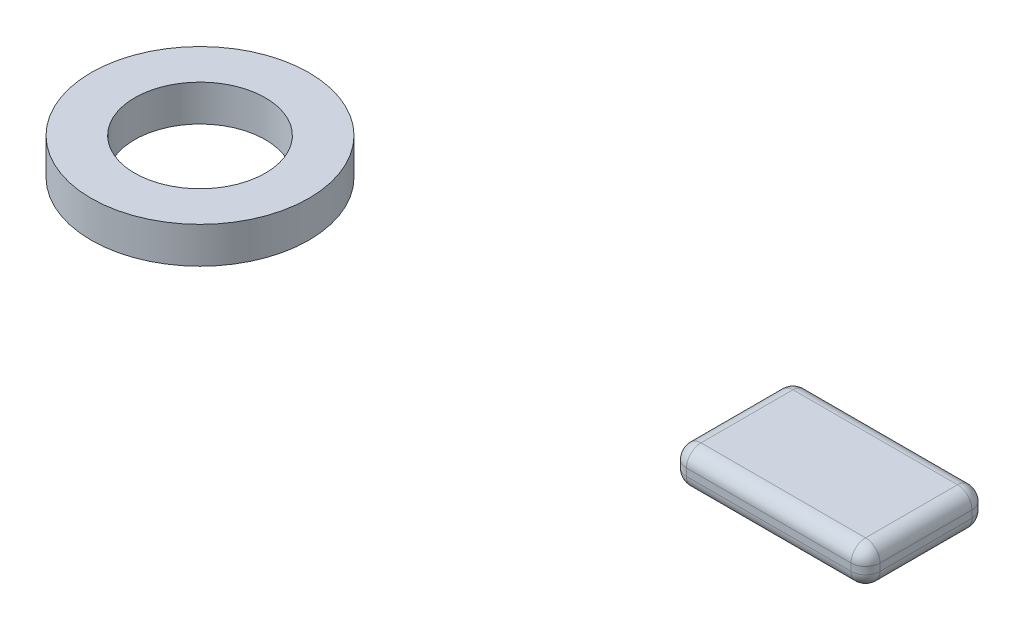
ISO-10303-21;
HEADER;
FILE_DESCRIPTION(('STEP AP214'),'2;1');
FILE_NAME('part.step','',(''),(''),'','','');
FILE_SCHEMA(('AUTOMOTIVE_DESIGN { 1 0 10303 214 1 1 1 1 }'));
ENDSEC;
DATA;
#1=APPLICATION_CONTEXT('core data for automotive mechanical design processes');
#2=APPLICATION_PROTOCOL_DEFINITION('international standard','automotive_design',2000,#1);
#3=PRODUCT_CONTEXT('',#1,'mechanical');
#4=PRODUCT('Part','Part','',(#3));
#5=PRODUCT_RELATED_PRODUCT_CATEGORY('part','',(#4));
#6=PRODUCT_DEFINITION_FORMATION('','',#4);
#7=PRODUCT_DEFINITION_CONTEXT('part definition',#1,'design');
#8=PRODUCT_DEFINITION('design','',#6,#7);
#9=PRODUCT_DEFINITION_SHAPE('','',#8);
#10=(LENGTH_UNIT() NAMED_UNIT(*) SI_UNIT(.MILLI.,.METRE.));
#11=(NAMED_UNIT(*) PLANE_ANGLE_UNIT() SI_UNIT($,.RADIAN.));
#12=(NAMED_UNIT(*) SI_UNIT($,.STERADIAN.) SOLID_ANGLE_UNIT());
#13=UNCERTAINTY_MEASURE_WITH_UNIT(LENGTH_MEASURE(1.E-05),#10,'distance_accuracy_value','');
#14=(GEOMETRIC_REPRESENTATION_CONTEXT(3) GLOBAL_UNCERTAINTY_ASSIGNED_CONTEXT((#13)) GLOBAL_UNIT_ASSIGNED_CONTEXT((#10,
#11,#12)) REPRESENTATION_CONTEXT('',''));
#15=CARTESIAN_POINT('',(0.,0.,0.));
#16=DIRECTION('',(0.,0.,1.));
#17=DIRECTION('',(1.,0.,0.));
#18=AXIS2_PLACEMENT_3D('',#15,#16,#17);
#19=CARTESIAN_POINT('',(0.,-39.5,151.));
#20=DIRECTION('',(0.,-1.,0.));
#21=DIRECTION('',(1.,0.,0.));
#22=AXIS2_PLACEMENT_3D('',#19,#20,#21);
#23=CYLINDRICAL_SURFACE('',#22,2.7);
#24=CARTESIAN_POINT('',(0.,-41.,151.));
#25=DIRECTION('',(0.,-1.,0.));
#26=DIRECTION('',(1.,0.,0.));
#27=AXIS2_PLACEMENT_3D('',#24,#25,#26);
#28=CIRCLE('',#27,2.7);
#29=CARTESIAN_POINT('',(2.7,-41.,151.));
#30=VERTEX_POINT('',#29);
#31=EDGE_CURVE('P0_E22',#30,#30,#28,.T.);
#32=ORIENTED_EDGE('',*,*,#31,.T.);
#33=EDGE_LOOP('',(#32));
#34=FACE_BOUND('',#33,.T.);
#35=CARTESIAN_POINT('',(0.,-39.5,151.));
#36=DIRECTION('',(0.,-1.,0.));
#37=DIRECTION('',(1.,0.,0.));
#38=AXIS2_PLACEMENT_3D('',#35,#36,#37);
#39=CIRCLE('',#38,2.7);
#40=CARTESIAN_POINT('',(2.7,-39.5,151.));
#41=VERTEX_POINT('',#40);
#42=EDGE_CURVE('P0_E10',#41,#41,#39,.T.);
#43=ORIENTED_EDGE('',*,*,#42,.F.);
#44=EDGE_LOOP('',(#43));
#45=FACE_BOUND('',#44,.T.);
#46=ADVANCED_FACE('P0_F15',(#34,#45),#23,.F.);
#47=CARTESIAN_POINT('',(0.,-39.5,151.));
#48=DIRECTION('',(0.,-1.,0.));
#49=DIRECTION('',(0.,0.,-1.));
#50=AXIS2_PLACEMENT_3D('',#47,#48,#49);
#51=PLANE('',#50);
#52=ORIENTED_EDGE('',*,*,#42,.T.);
#53=EDGE_LOOP('',(#52));
#54=FACE_BOUND('',#53,.T.);
#55=CARTESIAN_POINT('',(0.,-39.5,151.));
#56=DIRECTION('',(0.,-1.,0.));
#57=DIRECTION('',(1.,0.,0.));
#58=AXIS2_PLACEMENT_3D('',#55,#56,#57);
#59=CIRCLE('',#58,4.5);
#60=CARTESIAN_POINT('',(4.5,-39.5,151.));
#61=VERTEX_POINT('',#60);
#62=EDGE_CURVE('P0_E30',#61,#61,#59,.T.);
#63=ORIENTED_EDGE('',*,*,#62,.F.);
#64=EDGE_LOOP('',(#63));
#65=FACE_BOUND('',#64,.T.);
#66=ADVANCED_FACE('P0_F52',(#54,#65),#51,.F.);
#67=CARTESIAN_POINT('',(0.,-41.,151.));
#68=DIRECTION('',(0.,-1.,0.));
#69=DIRECTION('',(0.,0.,-1.));
#70=AXIS2_PLACEMENT_3D('',#67,#68,#69);
#71=PLANE('',#70);
#72=ORIENTED_EDGE('',*,*,#31,.F.);
#73=EDGE_LOOP('',(#72));
#74=FACE_BOUND('',#73,.T.);
#75=CARTESIAN_POINT('',(0.,-41.,151.));
#76=DIRECTION('',(0.,-1.,0.));
#77=DIRECTION('',(1.,0.,0.));
#78=AXIS2_PLACEMENT_3D('',#75,#76,#77);
#79=CIRCLE('',#78,4.5);
#80=CARTESIAN_POINT('',(4.5,-41.,151.));
#81=VERTEX_POINT('',#80);
#82=EDGE_CURVE('P0_E36',#81,#81,#79,.T.);
#83=ORIENTED_EDGE('',*,*,#82,.T.);
#84=EDGE_LOOP('',(#83));
#85=FACE_BOUND('',#84,.T.);
#86=ADVANCED_FACE('P0_F44',(#74,#85),#71,.T.);
#87=CARTESIAN_POINT('',(0.,-39.5,151.));
#88=DIRECTION('',(0.,-1.,0.));
#89=DIRECTION('',(1.,0.,0.));
#90=AXIS2_PLACEMENT_3D('',#87,#88,#89);
#91=CYLINDRICAL_SURFACE('',#90,4.5);
#92=ORIENTED_EDGE('',*,*,#82,.F.);
#93=EDGE_LOOP('',(#92));
#94=FACE_BOUND('',#93,.T.);
#95=ORIENTED_EDGE('',*,*,#62,.T.);
#96=EDGE_LOOP('',(#95));
#97=FACE_BOUND('',#96,.T.);
#98=ADVANCED_FACE('P0_F46',(#94,#97),#91,.T.);
#99=CLOSED_SHELL('',(#46,#66,#86,#98));
#100=MANIFOLD_SOLID_BREP('P0_B1',#99);
#101=CARTESIAN_POINT('',(29.4,-38.85,152.9));
#102=DIRECTION('',(0.,-1.,0.));
#103=DIRECTION('',(1.,0.,0.));
#104=AXIS2_PLACEMENT_3D('',#101,#102,#103);
#105=SPHERICAL_SURFACE('',#104,0.6);
#106=CARTESIAN_POINT('',(29.4,-38.85,152.9));
#107=DIRECTION('',(0.,0.,-1.));
#108=DIRECTION('',(1.,0.,0.));
#109=AXIS2_PLACEMENT_3D('',#106,#107,#108);
#110=CIRCLE('',#109,0.6);
#111=CARTESIAN_POINT('',(29.4,-38.25,152.9));
#112=VERTEX_POINT('',#111);
#113=CARTESIAN_POINT('',(30.,-38.85,152.9));
#114=VERTEX_POINT('',#113);
#115=EDGE_CURVE('P1_E10',#112,#114,#110,.T.);
#116=ORIENTED_EDGE('',*,*,#115,.F.);
#117=CARTESIAN_POINT('',(29.4,-38.85,152.9));
#118=DIRECTION('',(1.,0.,0.));
#119=DIRECTION('',(0.,0.,1.));
#120=AXIS2_PLACEMENT_3D('',#117,#118,#119);
#121=CIRCLE('',#120,0.6);
#122=CARTESIAN_POINT('',(29.4,-38.85,153.5));
#123=VERTEX_POINT('',#122);
#124=EDGE_CURVE('P1_E129',#112,#123,#121,.T.);
#125=ORIENTED_EDGE('',*,*,#124,.T.);
#126=CARTESIAN_POINT('',(29.4,-38.85,152.9));
#127=DIRECTION('',(0.,-1.,0.));
#128=DIRECTION('',(1.,0.,0.));
#129=AXIS2_PLACEMENT_3D('',#126,#127,#128);
#130=CIRCLE('',#129,0.6);
#131=EDGE_CURVE('P1_E118',#114,#123,#130,.T.);
#132=ORIENTED_EDGE('',*,*,#131,.F.);
#133=EDGE_LOOP('',(#116,#125,#132));
#134=FACE_BOUND('',#133,.T.);
#135=ADVANCED_FACE('P1_F16',(#134),#105,.T.);
#136=CARTESIAN_POINT('',(29.4,-38.85,149.1));
#137=DIRECTION('',(0.,0.,1.));
#138=DIRECTION('',(1.,0.,0.));
#139=AXIS2_PLACEMENT_3D('',#136,#137,#138);
#140=SPHERICAL_SURFACE('',#139,0.6);
#141=CARTESIAN_POINT('',(29.4,-38.85,149.1));
#142=DIRECTION('',(0.,-1.,0.));
#143=DIRECTION('',(1.,0.,0.));
#144=AXIS2_PLACEMENT_3D('',#141,#142,#143);
#145=CIRCLE('',#144,0.6);
#146=CARTESIAN_POINT('',(29.4,-38.85,148.5));
#147=VERTEX_POINT('',#146);
#148=CARTESIAN_POINT('',(30.,-38.85,149.1));
#149=VERTEX_POINT('',#148);
#150=EDGE_CURVE('P1_E161',#147,#149,#145,.T.);
#151=ORIENTED_EDGE('',*,*,#150,.F.);
#152=CARTESIAN_POINT('',(29.4,-38.85,149.1));
#153=DIRECTION('',(1.,0.,0.));
#154=DIRECTION('',(0.,1.,0.));
#155=AXIS2_PLACEMENT_3D('',#152,#153,#154);
#156=CIRCLE('',#155,0.6);
#157=CARTESIAN_POINT('',(29.4,-38.25,149.1));
#158=VERTEX_POINT('',#157);
#159=EDGE_CURVE('P1_E138',#147,#158,#156,.T.);
#160=ORIENTED_EDGE('',*,*,#159,.T.);
#161=CARTESIAN_POINT('',(29.4,-38.85,149.1));
#162=DIRECTION('',(0.,0.,1.));
#163=DIRECTION('',(1.,0.,0.));
#164=AXIS2_PLACEMENT_3D('',#161,#162,#163);
#165=CIRCLE('',#164,0.6);
#166=EDGE_CURVE('P1_E19',#149,#158,#165,.T.);
#167=ORIENTED_EDGE('',*,*,#166,.F.);
#168=EDGE_LOOP('',(#151,#160,#167));
#169=FACE_BOUND('',#168,.T.);
#170=ADVANCED_FACE('P1_F176',(#169),#140,.T.);
#171=CARTESIAN_POINT('',(30.,-39.75,148.5));
#172=DIRECTION('',(1.,0.,0.));
#173=DIRECTION('',(0.,1.,0.));
#174=AXIS2_PLACEMENT_3D('',#171,#172,#173);
#175=PLANE('',#174);
#176=DIRECTION('',(0.,0.,1.));
#177=VECTOR('',#176,1.);
#178=CARTESIAN_POINT('',(30.,-39.15,148.5));
#179=LINE('',#178,#177);
#180=CARTESIAN_POINT('',(30.,-39.15,149.1));
#181=VERTEX_POINT('',#180);
#182=CARTESIAN_POINT('',(30.,-39.15,152.9));
#183=VERTEX_POINT('',#182);
#184=EDGE_CURVE('P1_E125',#181,#183,#179,.T.);
#185=ORIENTED_EDGE('',*,*,#184,.F.);
#186=DIRECTION('',(0.,1.,0.));
#187=VECTOR('',#186,1.);
#188=CARTESIAN_POINT('',(30.,-39.75,149.1));
#189=LINE('',#188,#187);
#190=EDGE_CURVE('P1_E164',#181,#149,#189,.T.);
#191=ORIENTED_EDGE('',*,*,#190,.T.);
#192=DIRECTION('',(0.,0.,1.));
#193=VECTOR('',#192,1.);
#194=CARTESIAN_POINT('',(30.,-38.85,148.5));
#195=LINE('',#194,#193);
#196=EDGE_CURVE('P1_E117',#149,#114,#195,.T.);
#197=ORIENTED_EDGE('',*,*,#196,.T.);
#198=DIRECTION('',(0.,1.,0.));
#199=VECTOR('',#198,1.);
#200=CARTESIAN_POINT('',(30.,-39.75,152.9));
#201=LINE('',#200,#199);
#202=EDGE_CURVE('P1_E108',#183,#114,#201,.T.);
#203=ORIENTED_EDGE('',*,*,#202,.F.);
#204=EDGE_LOOP('',(#185,#191,#197,#203));
#205=FACE_BOUND('',#204,.T.);
#206=ADVANCED_FACE('P1_F123',(#205),#175,.T.);
#207=CARTESIAN_POINT('',(29.4,-39.15,152.9));
#208=DIRECTION('',(0.,0.,-1.));
#209=DIRECTION('',(1.,0.,0.));
#210=AXIS2_PLACEMENT_3D('',#207,#208,#209);
#211=SPHERICAL_SURFACE('',#210,0.6);
#212=CARTESIAN_POINT('',(29.4,-39.15,152.9));
#213=DIRECTION('',(0.,1.,0.));
#214=DIRECTION('',(1.,0.,0.));
#215=AXIS2_PLACEMENT_3D('',#212,#213,#214);
#216=CIRCLE('',#215,0.6);
#217=CARTESIAN_POINT('',(29.4,-39.15,153.5));
#218=VERTEX_POINT('',#217);
#219=EDGE_CURVE('P1_E105',#218,#183,#216,.T.);
#220=ORIENTED_EDGE('',*,*,#219,.F.);
#221=CARTESIAN_POINT('',(29.4,-39.15,152.9));
#222=DIRECTION('',(1.,0.,0.));
#223=DIRECTION('',(0.,-1.,0.));
#224=AXIS2_PLACEMENT_3D('',#221,#222,#223);
#225=CIRCLE('',#224,0.6);
#226=CARTESIAN_POINT('',(29.4,-39.75,152.9));
#227=VERTEX_POINT('',#226);
#228=EDGE_CURVE('P1_E141',#218,#227,#225,.T.);
#229=ORIENTED_EDGE('',*,*,#228,.T.);
#230=CARTESIAN_POINT('',(29.4,-39.15,152.9));
#231=DIRECTION('',(0.,0.,-1.));
#232=DIRECTION('',(1.,0.,0.));
#233=AXIS2_PLACEMENT_3D('',#230,#231,#232);
#234=CIRCLE('',#233,0.6);
#235=EDGE_CURVE('P1_E134',#183,#227,#234,.T.);
#236=ORIENTED_EDGE('',*,*,#235,.F.);
#237=EDGE_LOOP('',(#220,#229,#236));
#238=FACE_BOUND('',#237,.T.);
#239=ADVANCED_FACE('P1_F140',(#238),#211,.T.);
#240=CARTESIAN_POINT('',(29.4,-39.15,149.1));
#241=DIRECTION('',(0.,0.,1.));
#242=DIRECTION('',(1.,0.,0.));
#243=AXIS2_PLACEMENT_3D('',#240,#241,#242);
#244=SPHERICAL_SURFACE('',#243,0.6);
#245=CARTESIAN_POINT('',(29.4,-39.15,149.1));
#246=DIRECTION('',(0.,0.,-1.));
#247=DIRECTION('',(1.,0.,0.));
#248=AXIS2_PLACEMENT_3D('',#245,#246,#247);
#249=CIRCLE('',#248,0.6);
#250=CARTESIAN_POINT('',(29.4,-39.75,149.1));
#251=VERTEX_POINT('',#250);
#252=EDGE_CURVE('P1_E136',#181,#251,#249,.T.);
#253=ORIENTED_EDGE('',*,*,#252,.T.);
#254=CARTESIAN_POINT('',(29.4,-39.15,149.1));
#255=DIRECTION('',(-1.,0.,0.));
#256=DIRECTION('',(0.,-1.,0.));
#257=AXIS2_PLACEMENT_3D('',#254,#255,#256);
#258=CIRCLE('',#257,0.6);
#259=CARTESIAN_POINT('',(29.4,-39.15,148.5));
#260=VERTEX_POINT('',#259);
#261=EDGE_CURVE('P1_E150',#260,#251,#258,.T.);
#262=ORIENTED_EDGE('',*,*,#261,.F.);
#263=CARTESIAN_POINT('',(29.4,-39.15,149.1));
#264=DIRECTION('',(0.,-1.,0.));
#265=DIRECTION('',(1.,0.,0.));
#266=AXIS2_PLACEMENT_3D('',#263,#264,#265);
#267=CIRCLE('',#266,0.6);
#268=EDGE_CURVE('P1_E157',#260,#181,#267,.T.);
#269=ORIENTED_EDGE('',*,*,#268,.T.);
#270=EDGE_LOOP('',(#253,#262,#269));
#271=FACE_BOUND('',#270,.T.);
#272=ADVANCED_FACE('P1_F425',(#271),#244,.T.);
#273=CARTESIAN_POINT('',(29.4,-38.85,148.5));
#274=DIRECTION('',(0.,0.,1.));
#275=DIRECTION('',(1.,0.,0.));
#276=AXIS2_PLACEMENT_3D('',#273,#274,#275);
#277=CYLINDRICAL_SURFACE('',#276,0.6);
#278=ORIENTED_EDGE('',*,*,#196,.F.);
#279=ORIENTED_EDGE('',*,*,#166,.T.);
#280=DIRECTION('',(0.,0.,1.));
#281=VECTOR('',#280,1.);
#282=CARTESIAN_POINT('',(29.4,-38.25,148.5));
#283=LINE('',#282,#281);
#284=EDGE_CURVE('P1_E172',#158,#112,#283,.T.);
#285=ORIENTED_EDGE('',*,*,#284,.T.);
#286=ORIENTED_EDGE('',*,*,#115,.T.);
#287=EDGE_LOOP('',(#278,#279,#285,#286));
#288=FACE_BOUND('',#287,.T.);
#289=ADVANCED_FACE('P1_F170',(#288),#277,.T.);
#290=CARTESIAN_POINT('',(29.4,-39.75,152.9));
#291=DIRECTION('',(0.,1.,0.));
#292=DIRECTION('',(1.,0.,0.));
#293=AXIS2_PLACEMENT_3D('',#290,#291,#292);
#294=CYLINDRICAL_SURFACE('',#293,0.6);
#295=ORIENTED_EDGE('',*,*,#202,.T.);
#296=ORIENTED_EDGE('',*,*,#131,.T.);
#297=DIRECTION('',(0.,1.,0.));
#298=VECTOR('',#297,1.);
#299=CARTESIAN_POINT('',(29.4,-39.75,153.5));
#300=LINE('',#299,#298);
#301=EDGE_CURVE('P1_E110',#218,#123,#300,.T.);
#302=ORIENTED_EDGE('',*,*,#301,.F.);
#303=ORIENTED_EDGE('',*,*,#219,.T.);
#304=EDGE_LOOP('',(#295,#296,#302,#303));
#305=FACE_BOUND('',#304,.T.);
#306=ADVANCED_FACE('P1_F107',(#305),#294,.T.);
#307=CARTESIAN_POINT('',(22.,-38.85,152.9));
#308=DIRECTION('',(1.,0.,0.));
#309=DIRECTION('',(0.,1.,0.));
#310=AXIS2_PLACEMENT_3D('',#307,#308,#309);
#311=CYLINDRICAL_SURFACE('',#310,0.6);
#312=CARTESIAN_POINT('',(22.6,-38.85,152.9));
#313=DIRECTION('',(1.,0.,0.));
#314=DIRECTION('',(0.,0.,1.));
#315=AXIS2_PLACEMENT_3D('',#312,#313,#314);
#316=CIRCLE('',#315,0.6);
#317=CARTESIAN_POINT('',(22.6,-38.25,152.9));
#318=VERTEX_POINT('',#317);
#319=CARTESIAN_POINT('',(22.6,-38.85,153.5));
#320=VERTEX_POINT('',#319);
#321=EDGE_CURVE('P1_E199',#318,#320,#316,.T.);
#322=ORIENTED_EDGE('',*,*,#321,.T.);
#323=DIRECTION('',(1.,0.,0.));
#324=VECTOR('',#323,1.);
#325=CARTESIAN_POINT('',(22.,-38.85,153.5));
#326=LINE('',#325,#324);
#327=EDGE_CURVE('P1_E253',#320,#123,#326,.T.);
#328=ORIENTED_EDGE('',*,*,#327,.T.);
#329=ORIENTED_EDGE('',*,*,#124,.F.);
#330=DIRECTION('',(1.,0.,0.));
#331=VECTOR('',#330,1.);
#332=CARTESIAN_POINT('',(22.,-38.25,152.9));
#333=LINE('',#332,#331);
#334=EDGE_CURVE('P1_E193',#318,#112,#333,.T.);
#335=ORIENTED_EDGE('',*,*,#334,.F.);
#336=EDGE_LOOP('',(#322,#328,#329,#335));
#337=FACE_BOUND('',#336,.T.);
#338=ADVANCED_FACE('P1_F262',(#337),#311,.T.);
#339=CARTESIAN_POINT('',(29.4,-39.75,149.1));
#340=DIRECTION('',(0.,1.,0.));
#341=DIRECTION('',(1.,0.,0.));
#342=AXIS2_PLACEMENT_3D('',#339,#340,#341);
#343=CYLINDRICAL_SURFACE('',#342,0.6);
#344=ORIENTED_EDGE('',*,*,#268,.F.);
#345=DIRECTION('',(0.,1.,0.));
#346=VECTOR('',#345,1.);
#347=CARTESIAN_POINT('',(29.4,-39.75,148.5));
#348=LINE('',#347,#346);
#349=EDGE_CURVE('P1_E243',#260,#147,#348,.T.);
#350=ORIENTED_EDGE('',*,*,#349,.T.);
#351=ORIENTED_EDGE('',*,*,#150,.T.);
#352=ORIENTED_EDGE('',*,*,#190,.F.);
#353=EDGE_LOOP('',(#344,#350,#351,#352));
#354=FACE_BOUND('',#353,.T.);
#355=ADVANCED_FACE('P1_F434',(#354),#343,.T.);
#356=CARTESIAN_POINT('',(22.,-38.85,149.1));
#357=DIRECTION('',(1.,0.,0.));
#358=DIRECTION('',(0.,1.,0.));
#359=AXIS2_PLACEMENT_3D('',#356,#357,#358);
#360=CYLINDRICAL_SURFACE('',#359,0.6);
#361=DIRECTION('',(1.,0.,0.));
#362=VECTOR('',#361,1.);
#363=CARTESIAN_POINT('',(22.,-38.25,149.1));
#364=LINE('',#363,#362);
#365=CARTESIAN_POINT('',(22.6,-38.25,149.1));
#366=VERTEX_POINT('',#365);
#367=EDGE_CURVE('P1_E183',#366,#158,#364,.T.);
#368=ORIENTED_EDGE('',*,*,#367,.T.);
#369=ORIENTED_EDGE('',*,*,#159,.F.);
#370=DIRECTION('',(1.,0.,0.));
#371=VECTOR('',#370,1.);
#372=CARTESIAN_POINT('',(22.,-38.85,148.5));
#373=LINE('',#372,#371);
#374=CARTESIAN_POINT('',(22.6,-38.85,148.5));
#375=VERTEX_POINT('',#374);
#376=EDGE_CURVE('P1_E239',#375,#147,#373,.T.);
#377=ORIENTED_EDGE('',*,*,#376,.F.);
#378=CARTESIAN_POINT('',(22.6,-38.85,149.1));
#379=DIRECTION('',(1.,0.,0.));
#380=DIRECTION('',(0.,1.,0.));
#381=AXIS2_PLACEMENT_3D('',#378,#379,#380);
#382=CIRCLE('',#381,0.6);
#383=EDGE_CURVE('P1_E185',#375,#366,#382,.T.);
#384=ORIENTED_EDGE('',*,*,#383,.T.);
#385=EDGE_LOOP('',(#368,#369,#377,#384));
#386=FACE_BOUND('',#385,.T.);
#387=ADVANCED_FACE('P1_F184',(#386),#360,.T.);
#388=CARTESIAN_POINT('',(29.4,-39.15,148.5));
#389=DIRECTION('',(0.,0.,1.));
#390=DIRECTION('',(1.,0.,0.));
#391=AXIS2_PLACEMENT_3D('',#388,#389,#390);
#392=CYLINDRICAL_SURFACE('',#391,0.6);
#393=ORIENTED_EDGE('',*,*,#235,.T.);
#394=DIRECTION('',(0.,0.,1.));
#395=VECTOR('',#394,1.);
#396=CARTESIAN_POINT('',(29.4,-39.75,148.5));
#397=LINE('',#396,#395);
#398=EDGE_CURVE('P1_E218',#251,#227,#397,.T.);
#399=ORIENTED_EDGE('',*,*,#398,.F.);
#400=ORIENTED_EDGE('',*,*,#252,.F.);
#401=ORIENTED_EDGE('',*,*,#184,.T.);
#402=EDGE_LOOP('',(#393,#399,#400,#401));
#403=FACE_BOUND('',#402,.T.);
#404=ADVANCED_FACE('P1_F132',(#403),#392,.T.);
#405=CARTESIAN_POINT('',(22.,-39.15,152.9));
#406=DIRECTION('',(1.,0.,0.));
#407=DIRECTION('',(0.,-1.,0.));
#408=AXIS2_PLACEMENT_3D('',#405,#406,#407);
#409=CYLINDRICAL_SURFACE('',#408,0.6);
#410=DIRECTION('',(1.,0.,0.));
#411=VECTOR('',#410,1.);
#412=CARTESIAN_POINT('',(22.,-39.75,152.9));
#413=LINE('',#412,#411);
#414=CARTESIAN_POINT('',(22.6,-39.75,152.9));
#415=VERTEX_POINT('',#414);
#416=EDGE_CURVE('P1_E222',#415,#227,#413,.T.);
#417=ORIENTED_EDGE('',*,*,#416,.T.);
#418=ORIENTED_EDGE('',*,*,#228,.F.);
#419=DIRECTION('',(1.,0.,0.));
#420=VECTOR('',#419,1.);
#421=CARTESIAN_POINT('',(22.,-39.15,153.5));
#422=LINE('',#421,#420);
#423=CARTESIAN_POINT('',(22.6,-39.15,153.5));
#424=VERTEX_POINT('',#423);
#425=EDGE_CURVE('P1_E249',#424,#218,#422,.T.);
#426=ORIENTED_EDGE('',*,*,#425,.F.);
#427=CARTESIAN_POINT('',(22.6,-39.15,152.9));
#428=DIRECTION('',(1.,0.,0.));
#429=DIRECTION('',(0.,-1.,0.));
#430=AXIS2_PLACEMENT_3D('',#427,#428,#429);
#431=CIRCLE('',#430,0.6);
#432=EDGE_CURVE('P1_E230',#424,#415,#431,.T.);
#433=ORIENTED_EDGE('',*,*,#432,.T.);
#434=EDGE_LOOP('',(#417,#418,#426,#433));
#435=FACE_BOUND('',#434,.T.);
#436=ADVANCED_FACE('P1_F361',(#435),#409,.T.);
#437=CARTESIAN_POINT('',(22.,-39.15,149.1));
#438=DIRECTION('',(1.,0.,0.));
#439=DIRECTION('',(0.,-1.,0.));
#440=AXIS2_PLACEMENT_3D('',#437,#438,#439);
#441=CYLINDRICAL_SURFACE('',#440,0.6);
#442=CARTESIAN_POINT('',(22.6,-39.15,149.1));
#443=DIRECTION('',(-1.,0.,0.));
#444=DIRECTION('',(0.,-1.,0.));
#445=AXIS2_PLACEMENT_3D('',#442,#443,#444);
#446=CIRCLE('',#445,0.6);
#447=CARTESIAN_POINT('',(22.6,-39.15,148.5));
#448=VERTEX_POINT('',#447);
#449=CARTESIAN_POINT('',(22.6,-39.75,149.1));
#450=VERTEX_POINT('',#449);
#451=EDGE_CURVE('P1_E235',#448,#450,#446,.T.);
#452=ORIENTED_EDGE('',*,*,#451,.F.);
#453=DIRECTION('',(1.,0.,0.));
#454=VECTOR('',#453,1.);
#455=CARTESIAN_POINT('',(22.,-39.15,148.5));
#456=LINE('',#455,#454);
#457=EDGE_CURVE('P1_E213',#448,#260,#456,.T.);
#458=ORIENTED_EDGE('',*,*,#457,.T.);
#459=ORIENTED_EDGE('',*,*,#261,.T.);
#460=DIRECTION('',(1.,0.,0.));
#461=VECTOR('',#460,1.);
#462=CARTESIAN_POINT('',(22.,-39.75,149.1));
#463=LINE('',#462,#461);
#464=EDGE_CURVE('P1_E210',#450,#251,#463,.T.);
#465=ORIENTED_EDGE('',*,*,#464,.F.);
#466=EDGE_LOOP('',(#452,#458,#459,#465));
#467=FACE_BOUND('',#466,.T.);
#468=ADVANCED_FACE('P1_F208',(#467),#441,.T.);
#469=CARTESIAN_POINT('',(22.,-38.25,148.5));
#470=DIRECTION('',(0.,1.,0.));
#471=DIRECTION('',(1.,0.,0.));
#472=AXIS2_PLACEMENT_3D('',#469,#470,#471);
#473=PLANE('',#472);
#474=DIRECTION('',(0.,0.,1.));
#475=VECTOR('',#474,1.);
#476=CARTESIAN_POINT('',(22.6,-38.25,148.5));
#477=LINE('',#476,#475);
#478=EDGE_CURVE('P1_E302',#366,#318,#477,.T.);
#479=ORIENTED_EDGE('',*,*,#478,.T.);
#480=ORIENTED_EDGE('',*,*,#334,.T.);
#481=ORIENTED_EDGE('',*,*,#284,.F.);
#482=ORIENTED_EDGE('',*,*,#367,.F.);
#483=EDGE_LOOP('',(#479,#480,#481,#482));
#484=FACE_BOUND('',#483,.T.);
#485=ADVANCED_FACE('P1_F191',(#484),#473,.T.);
#486=CARTESIAN_POINT('',(22.6,-38.85,152.9));
#487=DIRECTION('',(0.,-1.,0.));
#488=DIRECTION('',(-1.,0.,0.));
#489=AXIS2_PLACEMENT_3D('',#486,#487,#488);
#490=SPHERICAL_SURFACE('',#489,0.6);
#491=CARTESIAN_POINT('',(22.6,-38.85,152.9));
#492=DIRECTION('',(0.,1.,0.));
#493=DIRECTION('',(-1.,0.,0.));
#494=AXIS2_PLACEMENT_3D('',#491,#492,#493);
#495=CIRCLE('',#494,0.6);
#496=CARTESIAN_POINT('',(22.,-38.85,152.9));
#497=VERTEX_POINT('',#496);
#498=EDGE_CURVE('P1_E277',#497,#320,#495,.T.);
#499=ORIENTED_EDGE('',*,*,#498,.T.);
#500=ORIENTED_EDGE('',*,*,#321,.F.);
#501=CARTESIAN_POINT('',(22.6,-38.85,152.9));
#502=DIRECTION('',(0.,0.,1.));
#503=DIRECTION('',(-1.,0.,0.));
#504=AXIS2_PLACEMENT_3D('',#501,#502,#503);
#505=CIRCLE('',#504,0.6);
#506=EDGE_CURVE('P1_E281',#318,#497,#505,.T.);
#507=ORIENTED_EDGE('',*,*,#506,.T.);
#508=EDGE_LOOP('',(#499,#500,#507));
#509=FACE_BOUND('',#508,.T.);
#510=ADVANCED_FACE('P1_F278',(#509),#490,.T.);
#511=CARTESIAN_POINT('',(22.,-39.75,153.5));
#512=DIRECTION('',(0.,0.,1.));
#513=DIRECTION('',(1.,0.,0.));
#514=AXIS2_PLACEMENT_3D('',#511,#512,#513);
#515=PLANE('',#514);
#516=DIRECTION('',(0.,1.,0.));
#517=VECTOR('',#516,1.);
#518=CARTESIAN_POINT('',(22.6,-39.75,153.5));
#519=LINE('',#518,#517);
#520=EDGE_CURVE('P1_E274',#424,#320,#519,.T.);
#521=ORIENTED_EDGE('',*,*,#520,.F.);
#522=ORIENTED_EDGE('',*,*,#425,.T.);
#523=ORIENTED_EDGE('',*,*,#301,.T.);
#524=ORIENTED_EDGE('',*,*,#327,.F.);
#525=EDGE_LOOP('',(#521,#522,#523,#524));
#526=FACE_BOUND('',#525,.T.);
#527=ADVANCED_FACE('P1_F272',(#526),#515,.T.);
#528=CARTESIAN_POINT('',(22.6,-38.85,149.1));
#529=DIRECTION('',(0.,0.,1.));
#530=DIRECTION('',(-1.,0.,0.));
#531=AXIS2_PLACEMENT_3D('',#528,#529,#530);
#532=SPHERICAL_SURFACE('',#531,0.6);
#533=CARTESIAN_POINT('',(22.6,-38.85,149.1));
#534=DIRECTION('',(0.,0.,-1.));
#535=DIRECTION('',(-1.,0.,0.));
#536=AXIS2_PLACEMENT_3D('',#533,#534,#535);
#537=CIRCLE('',#536,0.6);
#538=CARTESIAN_POINT('',(22.,-38.85,149.1));
#539=VERTEX_POINT('',#538);
#540=EDGE_CURVE('P1_E305',#539,#366,#537,.T.);
#541=ORIENTED_EDGE('',*,*,#540,.T.);
#542=ORIENTED_EDGE('',*,*,#383,.F.);
#543=CARTESIAN_POINT('',(22.6,-38.85,149.1));
#544=DIRECTION('',(0.,1.,0.));
#545=DIRECTION('',(-1.,0.,0.));
#546=AXIS2_PLACEMENT_3D('',#543,#544,#545);
#547=CIRCLE('',#546,0.6);
#548=EDGE_CURVE('P1_E331',#375,#539,#547,.T.);
#549=ORIENTED_EDGE('',*,*,#548,.T.);
#550=EDGE_LOOP('',(#541,#542,#549));
#551=FACE_BOUND('',#550,.T.);
#552=ADVANCED_FACE('P1_F382',(#551),#532,.T.);
#553=CARTESIAN_POINT('',(22.,-39.75,148.5));
#554=DIRECTION('',(0.,0.,1.));
#555=DIRECTION('',(1.,0.,0.));
#556=AXIS2_PLACEMENT_3D('',#553,#554,#555);
#557=PLANE('',#556);
#558=ORIENTED_EDGE('',*,*,#376,.T.);
#559=ORIENTED_EDGE('',*,*,#349,.F.);
#560=ORIENTED_EDGE('',*,*,#457,.F.);
#561=DIRECTION('',(0.,1.,0.));
#562=VECTOR('',#561,1.);
#563=CARTESIAN_POINT('',(22.6,-39.75,148.5));
#564=LINE('',#563,#562);
#565=EDGE_CURVE('P1_E324',#448,#375,#564,.T.);
#566=ORIENTED_EDGE('',*,*,#565,.T.);
#567=EDGE_LOOP('',(#558,#559,#560,#566));
#568=FACE_BOUND('',#567,.T.);
#569=ADVANCED_FACE('P1_F448',(#568),#557,.F.);
#570=CARTESIAN_POINT('',(22.,-39.75,148.5));
#571=DIRECTION('',(0.,1.,0.));
#572=DIRECTION('',(1.,0.,0.));
#573=AXIS2_PLACEMENT_3D('',#570,#571,#572);
#574=PLANE('',#573);
#575=ORIENTED_EDGE('',*,*,#464,.T.);
#576=ORIENTED_EDGE('',*,*,#398,.T.);
#577=ORIENTED_EDGE('',*,*,#416,.F.);
#578=DIRECTION('',(0.,0.,1.));
#579=VECTOR('',#578,1.);
#580=CARTESIAN_POINT('',(22.6,-39.75,148.5));
#581=LINE('',#580,#579);
#582=EDGE_CURVE('P1_E227',#450,#415,#581,.T.);
#583=ORIENTED_EDGE('',*,*,#582,.F.);
#584=EDGE_LOOP('',(#575,#576,#577,#583));
#585=FACE_BOUND('',#584,.T.);
#586=ADVANCED_FACE('P1_F225',(#585),#574,.F.);
#587=CARTESIAN_POINT('',(22.6,-39.15,152.9));
#588=DIRECTION('',(0.,0.,-1.));
#589=DIRECTION('',(-1.,0.,0.));
#590=AXIS2_PLACEMENT_3D('',#587,#588,#589);
#591=SPHERICAL_SURFACE('',#590,0.6);
#592=CARTESIAN_POINT('',(22.6,-39.15,152.9));
#593=DIRECTION('',(0.,0.,1.));
#594=DIRECTION('',(-1.,0.,0.));
#595=AXIS2_PLACEMENT_3D('',#592,#593,#594);
#596=CIRCLE('',#595,0.6);
#597=CARTESIAN_POINT('',(22.,-39.15,152.9));
#598=VERTEX_POINT('',#597);
#599=EDGE_CURVE('P1_E322',#598,#415,#596,.T.);
#600=ORIENTED_EDGE('',*,*,#599,.T.);
#601=ORIENTED_EDGE('',*,*,#432,.F.);
#602=CARTESIAN_POINT('',(22.6,-39.15,152.9));
#603=DIRECTION('',(0.,-1.,0.));
#604=DIRECTION('',(-1.,0.,0.));
#605=AXIS2_PLACEMENT_3D('',#602,#603,#604);
#606=CIRCLE('',#605,0.6);
#607=EDGE_CURVE('P1_E289',#424,#598,#606,.T.);
#608=ORIENTED_EDGE('',*,*,#607,.T.);
#609=EDGE_LOOP('',(#600,#601,#608));
#610=FACE_BOUND('',#609,.T.);
#611=ADVANCED_FACE('P1_F397',(#610),#591,.T.);
#612=CARTESIAN_POINT('',(22.6,-39.15,149.1));
#613=DIRECTION('',(0.,0.,1.));
#614=DIRECTION('',(-1.,0.,0.));
#615=AXIS2_PLACEMENT_3D('',#612,#613,#614);
#616=SPHERICAL_SURFACE('',#615,0.6);
#617=CARTESIAN_POINT('',(22.6,-39.15,149.1));
#618=DIRECTION('',(0.,1.,0.));
#619=DIRECTION('',(-1.,0.,0.));
#620=AXIS2_PLACEMENT_3D('',#617,#618,#619);
#621=CIRCLE('',#620,0.6);
#622=CARTESIAN_POINT('',(22.,-39.15,149.1));
#623=VERTEX_POINT('',#622);
#624=EDGE_CURVE('P1_E295',#448,#623,#621,.T.);
#625=ORIENTED_EDGE('',*,*,#624,.F.);
#626=ORIENTED_EDGE('',*,*,#451,.T.);
#627=CARTESIAN_POINT('',(22.6,-39.15,149.1));
#628=DIRECTION('',(0.,0.,1.));
#629=DIRECTION('',(-1.,0.,0.));
#630=AXIS2_PLACEMENT_3D('',#627,#628,#629);
#631=CIRCLE('',#630,0.6);
#632=EDGE_CURVE('P1_E354',#623,#450,#631,.T.);
#633=ORIENTED_EDGE('',*,*,#632,.F.);
#634=EDGE_LOOP('',(#625,#626,#633));
#635=FACE_BOUND('',#634,.T.);
#636=ADVANCED_FACE('P1_F401',(#635),#616,.T.);
#637=CARTESIAN_POINT('',(22.6,-38.85,148.5));
#638=DIRECTION('',(0.,0.,1.));
#639=DIRECTION('',(-1.,0.,0.));
#640=AXIS2_PLACEMENT_3D('',#637,#638,#639);
#641=CYLINDRICAL_SURFACE('',#640,0.6);
#642=ORIENTED_EDGE('',*,*,#506,.F.);
#643=ORIENTED_EDGE('',*,*,#478,.F.);
#644=ORIENTED_EDGE('',*,*,#540,.F.);
#645=DIRECTION('',(0.,0.,1.));
#646=VECTOR('',#645,1.);
#647=CARTESIAN_POINT('',(22.,-38.85,148.5));
#648=LINE('',#647,#646);
#649=EDGE_CURVE('P1_E344',#539,#497,#648,.T.);
#650=ORIENTED_EDGE('',*,*,#649,.T.);
#651=EDGE_LOOP('',(#642,#643,#644,#650));
#652=FACE_BOUND('',#651,.T.);
#653=ADVANCED_FACE('P1_F379',(#652),#641,.T.);
#654=CARTESIAN_POINT('',(22.6,-39.75,152.9));
#655=DIRECTION('',(0.,1.,0.));
#656=DIRECTION('',(-1.,0.,0.));
#657=AXIS2_PLACEMENT_3D('',#654,#655,#656);
#658=CYLINDRICAL_SURFACE('',#657,0.6);
#659=ORIENTED_EDGE('',*,*,#607,.F.);
#660=ORIENTED_EDGE('',*,*,#520,.T.);
#661=ORIENTED_EDGE('',*,*,#498,.F.);
#662=DIRECTION('',(0.,1.,0.));
#663=VECTOR('',#662,1.);
#664=CARTESIAN_POINT('',(22.,-39.75,152.9));
#665=LINE('',#664,#663);
#666=EDGE_CURVE('P1_E342',#598,#497,#665,.T.);
#667=ORIENTED_EDGE('',*,*,#666,.F.);
#668=EDGE_LOOP('',(#659,#660,#661,#667));
#669=FACE_BOUND('',#668,.T.);
#670=ADVANCED_FACE('P1_F287',(#669),#658,.T.);
#671=CARTESIAN_POINT('',(22.6,-39.75,149.1));
#672=DIRECTION('',(0.,1.,0.));
#673=DIRECTION('',(-1.,0.,0.));
#674=AXIS2_PLACEMENT_3D('',#671,#672,#673);
#675=CYLINDRICAL_SURFACE('',#674,0.6);
#676=DIRECTION('',(0.,1.,0.));
#677=VECTOR('',#676,1.);
#678=CARTESIAN_POINT('',(22.,-39.75,149.1));
#679=LINE('',#678,#677);
#680=EDGE_CURVE('P1_E347',#623,#539,#679,.T.);
#681=ORIENTED_EDGE('',*,*,#680,.T.);
#682=ORIENTED_EDGE('',*,*,#548,.F.);
#683=ORIENTED_EDGE('',*,*,#565,.F.);
#684=ORIENTED_EDGE('',*,*,#624,.T.);
#685=EDGE_LOOP('',(#681,#682,#683,#684));
#686=FACE_BOUND('',#685,.T.);
#687=ADVANCED_FACE('P1_F384',(#686),#675,.T.);
#688=CARTESIAN_POINT('',(22.6,-39.15,148.5));
#689=DIRECTION('',(0.,0.,1.));
#690=DIRECTION('',(-1.,0.,0.));
#691=AXIS2_PLACEMENT_3D('',#688,#689,#690);
#692=CYLINDRICAL_SURFACE('',#691,0.6);
#693=DIRECTION('',(0.,0.,1.));
#694=VECTOR('',#693,1.);
#695=CARTESIAN_POINT('',(22.,-39.15,148.5));
#696=LINE('',#695,#694);
#697=EDGE_CURVE('P1_E350',#623,#598,#696,.T.);
#698=ORIENTED_EDGE('',*,*,#697,.F.);
#699=ORIENTED_EDGE('',*,*,#632,.T.);
#700=ORIENTED_EDGE('',*,*,#582,.T.);
#701=ORIENTED_EDGE('',*,*,#599,.F.);
#702=EDGE_LOOP('',(#698,#699,#700,#701));
#703=FACE_BOUND('',#702,.T.);
#704=ADVANCED_FACE('P1_F399',(#703),#692,.T.);
#705=CARTESIAN_POINT('',(22.,-39.75,148.5));
#706=DIRECTION('',(1.,0.,0.));
#707=DIRECTION('',(0.,1.,0.));
#708=AXIS2_PLACEMENT_3D('',#705,#706,#707);
#709=PLANE('',#708);
#710=ORIENTED_EDGE('',*,*,#666,.T.);
#711=ORIENTED_EDGE('',*,*,#649,.F.);
#712=ORIENTED_EDGE('',*,*,#680,.F.);
#713=ORIENTED_EDGE('',*,*,#697,.T.);
#714=EDGE_LOOP('',(#710,#711,#712,#713));
#715=FACE_BOUND('',#714,.T.);
#716=ADVANCED_FACE('P1_F386',(#715),#709,.F.);
#717=CLOSED_SHELL('',(#135,#170,#206,#239,#272,#289,#306,#338,#355,#387,#404,#436,#468,#485,
#510,#527,#552,#569,#586,#611,#636,#653,#670,#687,#704,#716));
#718=MANIFOLD_SOLID_BREP('P1_B1',#717);
#719=ADVANCED_BREP_SHAPE_REPRESENTATION('',(#18,#100,#718),#14);
#720=SHAPE_DEFINITION_REPRESENTATION(#9,#719);
ENDSEC;
END-ISO-10303-21;
